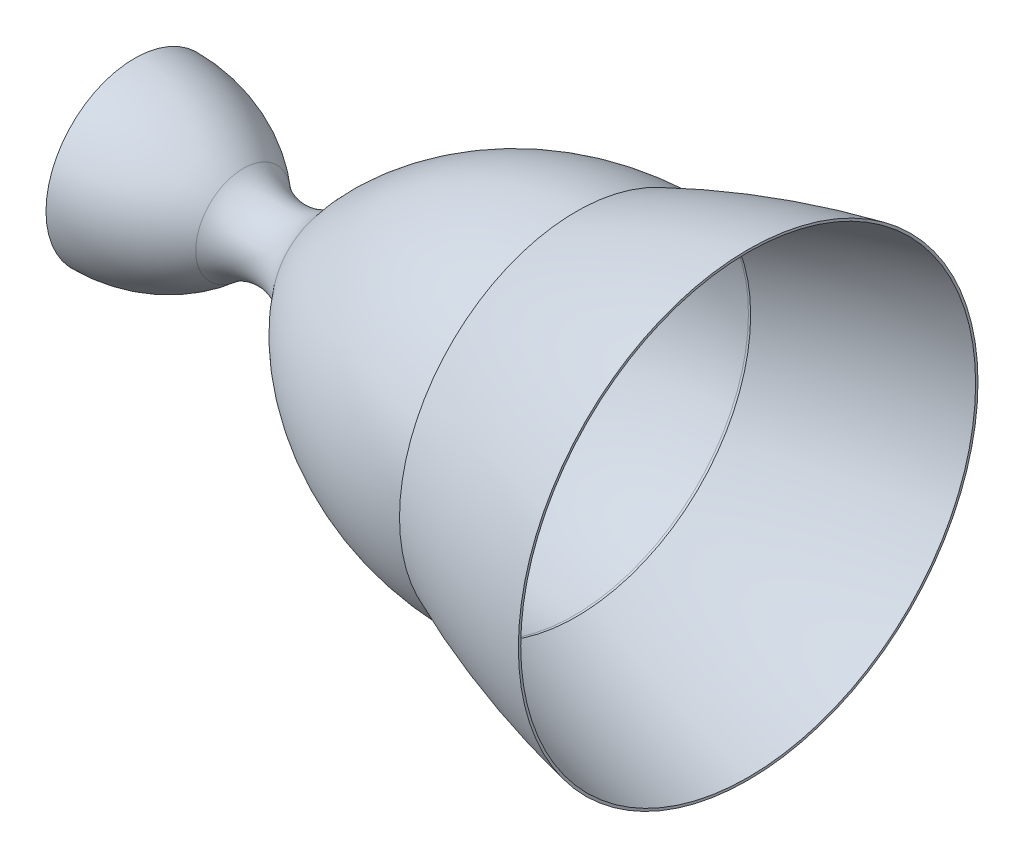
ISO-10303-21;
HEADER;
FILE_DESCRIPTION(('STEP AP214'),'2;1');
FILE_NAME('part.step','',(''),(''),'','','');
FILE_SCHEMA(('AUTOMOTIVE_DESIGN { 1 0 10303 214 1 1 1 1 }'));
ENDSEC;
DATA;
#1=APPLICATION_CONTEXT('core data for automotive mechanical design processes');
#2=APPLICATION_PROTOCOL_DEFINITION('international standard','automotive_design',2000,#1);
#3=PRODUCT_CONTEXT('',#1,'mechanical');
#4=PRODUCT('Part','Part','',(#3));
#5=PRODUCT_RELATED_PRODUCT_CATEGORY('part','',(#4));
#6=PRODUCT_DEFINITION_FORMATION('','',#4);
#7=PRODUCT_DEFINITION_CONTEXT('part definition',#1,'design');
#8=PRODUCT_DEFINITION('design','',#6,#7);
#9=PRODUCT_DEFINITION_SHAPE('','',#8);
#10=(LENGTH_UNIT() NAMED_UNIT(*) SI_UNIT(.MILLI.,.METRE.));
#11=(NAMED_UNIT(*) PLANE_ANGLE_UNIT() SI_UNIT($,.RADIAN.));
#12=(NAMED_UNIT(*) SI_UNIT($,.STERADIAN.) SOLID_ANGLE_UNIT());
#13=UNCERTAINTY_MEASURE_WITH_UNIT(LENGTH_MEASURE(1.E-05),#10,'distance_accuracy_value','');
#14=(GEOMETRIC_REPRESENTATION_CONTEXT(3) GLOBAL_UNCERTAINTY_ASSIGNED_CONTEXT((#13)) GLOBAL_UNIT_ASSIGNED_CONTEXT((#10,
#11,#12)) REPRESENTATION_CONTEXT('',''));
#15=CARTESIAN_POINT('',(0.,0.,0.));
#16=DIRECTION('',(0.,0.,1.));
#17=DIRECTION('',(1.,0.,0.));
#18=AXIS2_PLACEMENT_3D('',#15,#16,#17);
#19=CARTESIAN_POINT('',(356.292451395729,0.,0.));
#20=DIRECTION('',(-1.,0.,0.));
#21=DIRECTION('',(0.,0.,1.));
#22=AXIS2_PLACEMENT_3D('',#19,#20,#21);
#23=DEGENERATE_TOROIDAL_SURFACE('',#22,289.283418705397,400.,.F.);
#24=CARTESIAN_POINT('',(200.000000000023,0.,0.));
#25=DIRECTION('',(-1.,0.,0.));
#26=DIRECTION('',(0.,0.,1.));
#27=AXIS2_PLACEMENT_3D('',#24,#25,#26);
#28=CIRCLE('',#27,78.9185226755806);
#29=CARTESIAN_POINT('',(200.000000000023,0.,78.9185226755806));
#30=VERTEX_POINT('',#29);
#31=EDGE_CURVE('E73',#30,#30,#28,.T.);
#32=ORIENTED_EDGE('',*,*,#31,.T.);
#33=EDGE_LOOP('',(#32));
#34=FACE_BOUND('',#33,.T.);
#35=CARTESIAN_POINT('',(277.795971191793,0.,0.));
#36=DIRECTION('',(-1.,0.,0.));
#37=DIRECTION('',(0.,0.,1.));
#38=AXIS2_PLACEMENT_3D('',#35,#36,#37);
#39=CIRCLE('',#38,102.938843023324);
#40=CARTESIAN_POINT('',(277.795971191793,0.,102.938843023324));
#41=VERTEX_POINT('',#40);
#42=EDGE_CURVE('E10',#41,#41,#39,.T.);
#43=ORIENTED_EDGE('',*,*,#42,.F.);
#44=EDGE_LOOP('',(#43));
#45=FACE_BOUND('',#44,.T.);
#46=ADVANCED_FACE('F33',(#34,#45),#23,.T.);
#47=CARTESIAN_POINT('',(277.795971191793,0.,0.));
#48=DIRECTION('',(-1.,0.,0.));
#49=DIRECTION('',(0.,0.,1.));
#50=AXIS2_PLACEMENT_3D('',#47,#48,#49);
#51=PLANE('',#50);
#52=CARTESIAN_POINT('',(277.795971191793,0.,0.));
#53=DIRECTION('',(-1.,0.,0.));
#54=DIRECTION('',(0.,0.,1.));
#55=AXIS2_PLACEMENT_3D('',#52,#53,#54);
#56=CIRCLE('',#55,104.020320347749);
#57=CARTESIAN_POINT('',(277.795971191793,0.,104.020320347749));
#58=VERTEX_POINT('',#57);
#59=EDGE_CURVE('E39',#58,#58,#56,.T.);
#60=ORIENTED_EDGE('',*,*,#59,.F.);
#61=EDGE_LOOP('',(#60));
#62=FACE_BOUND('',#61,.T.);
#63=ORIENTED_EDGE('',*,*,#42,.T.);
#64=EDGE_LOOP('',(#63));
#65=FACE_BOUND('',#64,.T.);
#66=ADVANCED_FACE('F97',(#62,#65),#51,.F.);
#67=CARTESIAN_POINT('',(356.29245139571,0.,0.));
#68=DIRECTION('',(-1.,0.,0.));
#69=DIRECTION('',(0.,0.,1.));
#70=AXIS2_PLACEMENT_3D('',#67,#68,#69);
#71=DEGENERATE_TOROIDAL_SURFACE('',#70,288.201941380976,400.,.F.);
#72=CARTESIAN_POINT('',(200.,0.,0.));
#73=DIRECTION('',(-1.,0.,0.));
#74=DIRECTION('',(0.,0.,1.));
#75=AXIS2_PLACEMENT_3D('',#72,#73,#74);
#76=CIRCLE('',#75,80.);
#77=CARTESIAN_POINT('',(200.,0.,80.));
#78=VERTEX_POINT('',#77);
#79=EDGE_CURVE('E43',#78,#78,#76,.T.);
#80=ORIENTED_EDGE('',*,*,#79,.F.);
#81=EDGE_LOOP('',(#80));
#82=FACE_BOUND('',#81,.T.);
#83=ORIENTED_EDGE('',*,*,#59,.T.);
#84=EDGE_LOOP('',(#83));
#85=FACE_BOUND('',#84,.T.);
#86=ADVANCED_FACE('F101',(#82,#85),#71,.F.);
#87=CARTESIAN_POINT('',(200.,0.,0.));
#88=DIRECTION('',(-1.,0.,0.));
#89=DIRECTION('',(0.,0.,1.));
#90=AXIS2_PLACEMENT_3D('',#87,#88,#89);
#91=DEGENERATE_TOROIDAL_SURFACE('',#90,62.7059692307692,142.705969230769,.F.);
#92=CARTESIAN_POINT('',(87.5618755572571,0.,0.));
#93=DIRECTION('',(-1.,0.,0.));
#94=DIRECTION('',(0.,0.,1.));
#95=AXIS2_PLACEMENT_3D('',#92,#93,#94);
#96=CIRCLE('',#95,25.1727075110406);
#97=CARTESIAN_POINT('',(87.5618755572571,0.,25.1727075110406));
#98=VERTEX_POINT('',#97);
#99=EDGE_CURVE('E47',#98,#98,#96,.T.);
#100=ORIENTED_EDGE('',*,*,#99,.F.);
#101=EDGE_LOOP('',(#100));
#102=FACE_BOUND('',#101,.T.);
#103=ORIENTED_EDGE('',*,*,#79,.T.);
#104=EDGE_LOOP('',(#103));
#105=FACE_BOUND('',#104,.T.);
#106=ADVANCED_FACE('F106',(#102,#105),#91,.F.);
#107=CARTESIAN_POINT('',(66.7,0.,0.));
#108=DIRECTION('',(-1.,0.,0.));
#109=DIRECTION('',(0.,0.,1.));
#110=AXIS2_PLACEMENT_3D('',#107,#108,#109);
#111=TOROIDAL_SURFACE('',#110,41.4778,26.4778);
#112=ORIENTED_EDGE('',*,*,#99,.T.);
#113=EDGE_LOOP('',(#112));
#114=FACE_BOUND('',#113,.T.);
#115=CARTESIAN_POINT('',(49.2964963765474,0.,0.));
#116=DIRECTION('',(-1.,0.,0.));
#117=DIRECTION('',(0.,0.,1.));
#118=AXIS2_PLACEMENT_3D('',#115,#116,#117);
#119=CIRCLE('',#118,21.5230523326284);
#120=CARTESIAN_POINT('',(49.2964963765474,0.,21.5230523326284));
#121=VERTEX_POINT('',#120);
#122=EDGE_CURVE('E52',#121,#121,#119,.T.);
#123=ORIENTED_EDGE('',*,*,#122,.F.);
#124=EDGE_LOOP('',(#123));
#125=FACE_BOUND('',#124,.T.);
#126=ADVANCED_FACE('F112',(#114,#125),#111,.F.);
#127=CARTESIAN_POINT('',(0.,0.,0.));
#128=DIRECTION('',(-1.,0.,0.));
#129=DIRECTION('',(0.,0.,1.));
#130=AXIS2_PLACEMENT_3D('',#127,#128,#129);
#131=DEGENERATE_TOROIDAL_SURFACE('',#130,35.,75.,.F.);
#132=CARTESIAN_POINT('',(0.,0.,0.));
#133=DIRECTION('',(-1.,0.,0.));
#134=DIRECTION('',(0.,0.,1.));
#135=AXIS2_PLACEMENT_3D('',#132,#133,#134);
#136=CIRCLE('',#135,40.);
#137=CARTESIAN_POINT('',(0.,0.,40.));
#138=VERTEX_POINT('',#137);
#139=EDGE_CURVE('E55',#138,#138,#136,.T.);
#140=ORIENTED_EDGE('',*,*,#139,.F.);
#141=EDGE_LOOP('',(#140));
#142=FACE_BOUND('',#141,.T.);
#143=ORIENTED_EDGE('',*,*,#122,.T.);
#144=EDGE_LOOP('',(#143));
#145=FACE_BOUND('',#144,.T.);
#146=ADVANCED_FACE('F116',(#142,#145),#131,.F.);
#147=CARTESIAN_POINT('',(0.,0.,0.));
#148=DIRECTION('',(-1.,0.,0.));
#149=DIRECTION('',(0.,0.,1.));
#150=AXIS2_PLACEMENT_3D('',#147,#148,#149);
#151=PLANE('',#150);
#152=ORIENTED_EDGE('',*,*,#139,.T.);
#153=EDGE_LOOP('',(#152));
#154=FACE_BOUND('',#153,.T.);
#155=CARTESIAN_POINT('',(0.,0.,0.));
#156=DIRECTION('',(-1.,0.,0.));
#157=DIRECTION('',(0.,0.,1.));
#158=AXIS2_PLACEMENT_3D('',#155,#156,#157);
#159=CIRCLE('',#158,38.9152889034985);
#160=CARTESIAN_POINT('',(0.,0.,38.9152889034985));
#161=VERTEX_POINT('',#160);
#162=EDGE_CURVE('E58',#161,#161,#159,.T.);
#163=ORIENTED_EDGE('',*,*,#162,.F.);
#164=EDGE_LOOP('',(#163));
#165=FACE_BOUND('',#164,.T.);
#166=ADVANCED_FACE('F120',(#154,#165),#151,.T.);
#167=CARTESIAN_POINT('',(0.,0.,0.));
#168=DIRECTION('',(-1.,0.,0.));
#169=DIRECTION('',(0.,0.,1.));
#170=AXIS2_PLACEMENT_3D('',#167,#168,#169);
#171=CYLINDRICAL_SURFACE('',#170,38.9152889034985);
#172=ORIENTED_EDGE('',*,*,#162,.T.);
#173=EDGE_LOOP('',(#172));
#174=FACE_BOUND('',#173,.T.);
#175=CARTESIAN_POINT('',(1.,0.,0.));
#176=DIRECTION('',(-1.,0.,0.));
#177=DIRECTION('',(0.,0.,1.));
#178=AXIS2_PLACEMENT_3D('',#175,#176,#177);
#179=CIRCLE('',#178,38.9152889034985);
#180=CARTESIAN_POINT('',(1.,0.,38.9152889034985));
#181=VERTEX_POINT('',#180);
#182=EDGE_CURVE('E61',#181,#181,#179,.T.);
#183=ORIENTED_EDGE('',*,*,#182,.F.);
#184=EDGE_LOOP('',(#183));
#185=FACE_BOUND('',#184,.T.);
#186=ADVANCED_FACE('F124',(#174,#185),#171,.F.);
#187=CARTESIAN_POINT('',(0.,0.,0.));
#188=DIRECTION('',(-1.,0.,0.));
#189=DIRECTION('',(0.,0.,1.));
#190=AXIS2_PLACEMENT_3D('',#187,#188,#189);
#191=DEGENERATE_TOROIDAL_SURFACE('',#190,35.,73.9220530943753,.F.);
#192=ORIENTED_EDGE('',*,*,#182,.T.);
#193=EDGE_LOOP('',(#192));
#194=FACE_BOUND('',#193,.T.);
#195=CARTESIAN_POINT('',(48.5879763001842,0.,0.));
#196=DIRECTION('',(-1.,0.,0.));
#197=DIRECTION('',(0.,0.,1.));
#198=AXIS2_PLACEMENT_3D('',#195,#196,#197);
#199=CIRCLE('',#198,20.7106676745162);
#200=CARTESIAN_POINT('',(48.5879763001842,0.,20.7106676745162));
#201=VERTEX_POINT('',#200);
#202=EDGE_CURVE('E64',#201,#201,#199,.T.);
#203=ORIENTED_EDGE('',*,*,#202,.F.);
#204=EDGE_LOOP('',(#203));
#205=FACE_BOUND('',#204,.T.);
#206=ADVANCED_FACE('F93',(#194,#205),#191,.T.);
#207=CARTESIAN_POINT('',(66.7,0.,0.));
#208=DIRECTION('',(-1.,0.,0.));
#209=DIRECTION('',(0.,0.,1.));
#210=AXIS2_PLACEMENT_3D('',#207,#208,#209);
#211=TOROIDAL_SURFACE('',#210,41.4778,27.5557469056247);
#212=CARTESIAN_POINT('',(88.4111906137373,0.,0.));
#213=DIRECTION('',(-1.,0.,0.));
#214=DIRECTION('',(0.,0.,1.));
#215=AXIS2_PLACEMENT_3D('',#212,#213,#214);
#216=CIRCLE('',#215,24.5089052316065);
#217=CARTESIAN_POINT('',(88.4111906137373,0.,24.5089052316065));
#218=VERTEX_POINT('',#217);
#219=EDGE_CURVE('E67',#218,#218,#216,.T.);
#220=ORIENTED_EDGE('',*,*,#219,.F.);
#221=EDGE_LOOP('',(#220));
#222=FACE_BOUND('',#221,.T.);
#223=ORIENTED_EDGE('',*,*,#202,.T.);
#224=EDGE_LOOP('',(#223));
#225=FACE_BOUND('',#224,.T.);
#226=ADVANCED_FACE('F87',(#222,#225),#211,.T.);
#227=CARTESIAN_POINT('',(200.,0.,0.));
#228=DIRECTION('',(-1.,0.,0.));
#229=DIRECTION('',(0.,0.,1.));
#230=AXIS2_PLACEMENT_3D('',#227,#228,#229);
#231=DEGENERATE_TOROIDAL_SURFACE('',#230,62.7059692307692,141.628022325145,.F.);
#232=ORIENTED_EDGE('',*,*,#219,.T.);
#233=EDGE_LOOP('',(#232));
#234=FACE_BOUND('',#233,.T.);
#235=CARTESIAN_POINT('',(199.000000000041,0.,0.));
#236=DIRECTION('',(-1.,0.,0.));
#237=DIRECTION('',(0.,0.,1.));
#238=AXIS2_PLACEMENT_3D('',#235,#236,#237);
#239=CIRCLE('',#238,78.9185226755806);
#240=CARTESIAN_POINT('',(199.000000000041,0.,78.9185226755806));
#241=VERTEX_POINT('',#240);
#242=EDGE_CURVE('E70',#241,#241,#239,.T.);
#243=ORIENTED_EDGE('',*,*,#242,.F.);
#244=EDGE_LOOP('',(#243));
#245=FACE_BOUND('',#244,.T.);
#246=ADVANCED_FACE('F82',(#234,#245),#231,.T.);
#247=CARTESIAN_POINT('',(0.,0.,0.));
#248=DIRECTION('',(-1.,0.,0.));
#249=DIRECTION('',(0.,0.,1.));
#250=AXIS2_PLACEMENT_3D('',#247,#248,#249);
#251=CYLINDRICAL_SURFACE('',#250,78.9185226755806);
#252=ORIENTED_EDGE('',*,*,#31,.F.);
#253=EDGE_LOOP('',(#252));
#254=FACE_BOUND('',#253,.T.);
#255=ORIENTED_EDGE('',*,*,#242,.T.);
#256=EDGE_LOOP('',(#255));
#257=FACE_BOUND('',#256,.T.);
#258=ADVANCED_FACE('F79',(#254,#257),#251,.F.);
#259=CLOSED_SHELL('',(#46,#66,#86,#106,#126,#146,#166,#186,#206,#226,#246,#258));
#260=MANIFOLD_SOLID_BREP('B2',#259);
#261=ADVANCED_BREP_SHAPE_REPRESENTATION('',(#18,#260),#14);
#262=SHAPE_DEFINITION_REPRESENTATION(#9,#261);
ENDSEC;
END-ISO-10303-21;
